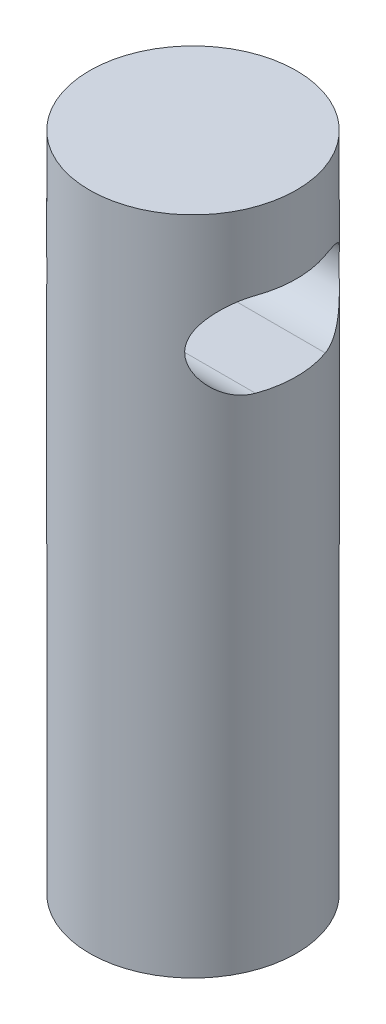
ISO-10303-21;
HEADER;
FILE_DESCRIPTION(('STEP AP214'),'2;1');
FILE_NAME('part.step','',(''),(''),'','','');
FILE_SCHEMA(('AUTOMOTIVE_DESIGN { 1 0 10303 214 1 1 1 1 }'));
ENDSEC;
DATA;
#1=APPLICATION_CONTEXT('core data for automotive mechanical design processes');
#2=APPLICATION_PROTOCOL_DEFINITION('international standard','automotive_design',2000,#1);
#3=PRODUCT_CONTEXT('',#1,'mechanical');
#4=PRODUCT('Part','Part','',(#3));
#5=PRODUCT_RELATED_PRODUCT_CATEGORY('part','',(#4));
#6=PRODUCT_DEFINITION_FORMATION('','',#4);
#7=PRODUCT_DEFINITION_CONTEXT('part definition',#1,'design');
#8=PRODUCT_DEFINITION('design','',#6,#7);
#9=PRODUCT_DEFINITION_SHAPE('','',#8);
#10=(LENGTH_UNIT() NAMED_UNIT(*) SI_UNIT(.MILLI.,.METRE.));
#11=(NAMED_UNIT(*) PLANE_ANGLE_UNIT() SI_UNIT($,.RADIAN.));
#12=(NAMED_UNIT(*) SI_UNIT($,.STERADIAN.) SOLID_ANGLE_UNIT());
#13=UNCERTAINTY_MEASURE_WITH_UNIT(LENGTH_MEASURE(1.E-05),#10,'distance_accuracy_value','');
#14=(GEOMETRIC_REPRESENTATION_CONTEXT(3) GLOBAL_UNCERTAINTY_ASSIGNED_CONTEXT((#13)) GLOBAL_UNIT_ASSIGNED_CONTEXT((#10,
#11,#12)) REPRESENTATION_CONTEXT('',''));
#15=CARTESIAN_POINT('',(0.,0.,0.));
#16=DIRECTION('',(0.,0.,1.));
#17=DIRECTION('',(1.,0.,0.));
#18=AXIS2_PLACEMENT_3D('',#15,#16,#17);
#19=CARTESIAN_POINT('',(35.4002937912872,14.9082543631315,4.51194637207664E-13));
#20=DIRECTION('',(0.,1.,0.));
#21=DIRECTION('',(0.,0.,1.));
#22=AXIS2_PLACEMENT_3D('',#19,#20,#21);
#23=PLANE('',#22);
#24=CARTESIAN_POINT('',(35.4002937912872,14.9082543631315,4.51194637207664E-13));
#25=DIRECTION('',(0.,1.,0.));
#26=DIRECTION('',(-1.,0.,0.));
#27=AXIS2_PLACEMENT_3D('',#24,#25,#26);
#28=CIRCLE('',#27,12.9417936178387);
#29=CARTESIAN_POINT('',(22.4585001734484,14.9082543631315,4.51194637207664E-13));
#30=VERTEX_POINT('',#29);
#31=EDGE_CURVE('E115',#30,#30,#28,.F.);
#32=ORIENTED_EDGE('',*,*,#31,.F.);
#33=EDGE_LOOP('',(#32));
#34=FACE_BOUND('',#33,.T.);
#35=ADVANCED_FACE('F17',(#34),#23,.T.);
#36=CARTESIAN_POINT('',(35.4002937912872,-67.7646765958145,4.51194637207664E-13));
#37=DIRECTION('',(0.,1.,0.));
#38=DIRECTION('',(0.,0.,1.));
#39=AXIS2_PLACEMENT_3D('',#36,#37,#38);
#40=PLANE('',#39);
#41=CARTESIAN_POINT('',(35.4002937912872,-67.7646765958145,4.51194637207664E-13));
#42=DIRECTION('',(0.,1.,0.));
#43=DIRECTION('',(-1.,0.,0.));
#44=AXIS2_PLACEMENT_3D('',#41,#42,#43);
#45=CIRCLE('',#44,12.9417936178387);
#46=CARTESIAN_POINT('',(22.4585001734485,-67.7646765958145,4.51194637207664E-13));
#47=VERTEX_POINT('',#46);
#48=EDGE_CURVE('E117',#47,#47,#45,.T.);
#49=ORIENTED_EDGE('',*,*,#48,.F.);
#50=EDGE_LOOP('',(#49));
#51=FACE_BOUND('',#50,.T.);
#52=ADVANCED_FACE('F135',(#51),#40,.F.);
#53=CARTESIAN_POINT('',(130.113737957699,0.,4.36306991880908));
#54=DIRECTION('',(-1.,0.,0.));
#55=DIRECTION('',(0.,0.,1.));
#56=AXIS2_PLACEMENT_3D('',#53,#54,#55);
#57=CYLINDRICAL_SURFACE('',#56,5.2931309127316);
#58=DIRECTION('',(1.,0.,0.));
#59=VECTOR('',#58,1.);
#60=CARTESIAN_POINT('',(130.113737957699,5.2931309127316,4.36306991880899));
#61=LINE('',#60,#59);
#62=CARTESIAN_POINT('',(23.216138386405,5.29313091273159,4.36306991880899));
#63=VERTEX_POINT('',#62);
#64=CARTESIAN_POINT('',(47.5844491961693,5.29313091273159,4.36306991880899));
#65=VERTEX_POINT('',#64);
#66=EDGE_CURVE('E74',#63,#65,#61,.T.);
#67=ORIENTED_EDGE('',*,*,#66,.T.);
#68=CARTESIAN_POINT('',(47.5844491961693,-5.29313091273162,4.36306991880898));
#69=CARTESIAN_POINT('',(47.5271020188366,-5.29314492778003,4.52330564350372));
#70=CARTESIAN_POINT('',(47.4665612286578,-5.28585680617279,4.68232495629311));
#71=CARTESIAN_POINT('',(47.3398025594427,-5.25743589827049,4.99666245818753));
#72=CARTESIAN_POINT('',(47.2735899938035,-5.23631594915716,5.15198394082592));
#73=CARTESIAN_POINT('',(47.1365302347509,-5.18116570919242,5.45697721985194));
#74=CARTESIAN_POINT('',(47.0657154976302,-5.14721910818373,5.60667886739294));
#75=CARTESIAN_POINT('',(46.919814134769,-5.06717971381946,5.90064707517697));
#76=CARTESIAN_POINT('',(46.8447265437414,-5.02108416726651,6.04491239495693));
#77=CARTESIAN_POINT('',(46.6147984261843,-4.86608437877842,6.46739345449884));
#78=CARTESIAN_POINT('',(46.454662589205,-4.74020535096499,6.73667877715361));
#79=CARTESIAN_POINT('',(46.1264757761287,-4.44772376924739,7.24787331192213));
#80=CARTESIAN_POINT('',(45.9584037034284,-4.28100709424203,7.48970297842774));
#81=CARTESIAN_POINT('',(45.6951557280491,-3.99078867522301,7.84419623551344));
#82=CARTESIAN_POINT('',(45.5999790530872,-3.8799042275666,7.96739130083269));
#83=CARTESIAN_POINT('',(45.4110837974091,-3.6463864564549,8.20347069289869));
#84=CARTESIAN_POINT('',(45.3173655758717,-3.52375029046515,8.31635251208857));
#85=CARTESIAN_POINT('',(45.1333502429961,-3.26706703888996,8.53097809321618));
#86=CARTESIAN_POINT('',(45.0430486364551,-3.13303575772931,8.63273684829698));
#87=CARTESIAN_POINT('',(44.8679672507369,-2.85350205798706,8.82439974968501));
#88=CARTESIAN_POINT('',(44.7831845656627,-2.70800576680439,8.9143101605129));
#89=CARTESIAN_POINT('',(44.596857808486,-2.35883120466317,9.10693257989718));
#90=CARTESIAN_POINT('',(44.4981800011797,-2.15102279582255,9.2050750944861));
#91=CARTESIAN_POINT('',(44.3224452816785,-1.71663150803967,9.37551502509914));
#92=CARTESIAN_POINT('',(44.245346993673,-1.49008565175978,9.44786197463446));
#93=CARTESIAN_POINT('',(44.1319169142332,-1.06083502395627,9.55268316136324));
#94=CARTESIAN_POINT('',(44.0909076704804,-0.860535574146742,9.58981902010655));
#95=CARTESIAN_POINT('',(44.034420433769,-0.453478951367316,9.64071539562677));
#96=CARTESIAN_POINT('',(44.0189188344552,-0.246727929888748,9.65449752574398));
#97=CARTESIAN_POINT('',(44.0154339217368,0.167566536548728,9.65760816352472));
#98=CARTESIAN_POINT('',(44.0274989285859,0.375110735358954,9.64689373225556));
#99=CARTESIAN_POINT('',(44.0776364178369,0.784425145299047,9.60181310086385));
#100=CARTESIAN_POINT('',(44.1157330161162,0.986189821489524,9.5674249690114));
#101=CARTESIAN_POINT('',(44.2257011791836,1.42774604467283,9.46620398366099));
#102=CARTESIAN_POINT('',(44.3035830127639,1.66465328273124,9.39346344609275));
#103=CARTESIAN_POINT('',(44.4831791209023,2.11841201626523,9.21990843339419));
#104=CARTESIAN_POINT('',(44.5849444130357,2.33521917315796,9.1190337726945));
#105=CARTESIAN_POINT('',(44.7698154434722,2.68376157325861,8.92826695460976));
#106=CARTESIAN_POINT('',(44.8489939556446,2.82110916884846,8.84458538236646));
#107=CARTESIAN_POINT('',(45.0124201967768,3.08568572986842,8.66669608565137));
#108=CARTESIAN_POINT('',(45.0966697803971,3.21291095322341,8.57248449907332));
#109=CARTESIAN_POINT('',(45.2684410081047,3.45731196921771,8.37418242873431));
#110=CARTESIAN_POINT('',(45.3559663909474,3.57447574310626,8.27008043466118));
#111=CARTESIAN_POINT('',(45.5326491972127,3.79850838297067,8.05264050996075));
#112=CARTESIAN_POINT('',(45.6218064466124,3.90537833915894,7.93930355975458));
#113=CARTESIAN_POINT('',(45.8024497982725,4.11091450519124,7.70116926527816));
#114=CARTESIAN_POINT('',(45.8939431781857,4.20934213858329,7.57617149311805));
#115=CARTESIAN_POINT('',(46.0760528287288,4.39488080220672,7.31732491157866));
#116=CARTESIAN_POINT('',(46.1666686918664,4.48198678823596,7.18347219680667));
#117=CARTESIAN_POINT('',(46.345622147684,4.64407622833415,6.90773179802886));
#118=CARTESIAN_POINT('',(46.4339646637474,4.71908813183959,6.76586406301956));
#119=CARTESIAN_POINT('',(46.6074792921983,4.85648960086918,6.47439258030772));
#120=CARTESIAN_POINT('',(46.6926531324546,4.91888613034735,6.32479315824746));
#121=CARTESIAN_POINT('',(46.851871543441,5.02557931183372,6.03132386768687));
#122=CARTESIAN_POINT('',(46.9262500290267,5.07095598098798,5.88802802879075));
#123=CARTESIAN_POINT('',(47.0707619352408,5.14972166059552,5.59613428667902));
#124=CARTESIAN_POINT('',(47.1408965492994,5.18311405432581,5.44753789290563));
#125=CARTESIAN_POINT('',(47.2765986708241,5.23732333290655,5.14499541840169));
#126=CARTESIAN_POINT('',(47.3421390006522,5.25807019514294,4.99102445331711));
#127=CARTESIAN_POINT('',(47.4676521579758,5.28598767891,4.67945807135853));
#128=CARTESIAN_POINT('',(47.5276195677564,5.29314521820928,4.52185930959644));
#129=CARTESIAN_POINT('',(47.5844491961693,5.29313091273158,4.36306991880898));
#130=B_SPLINE_CURVE_WITH_KNOTS('',3,(#68,#69,#70,#71,#72,#73,#74,#75,#76,#77,#78,#79,#80,#81,
#82,#83,#84,#85,#86,#87,#88,#89,#90,#91,#92,#93,#94,#95,#96,#97,#98,#99,#100,#101,#102,#103,
#104,#105,#106,#107,#108,#109,#110,#111,#112,#113,#114,#115,#116,#117,#118,#119,#120,#121,#122,
#123,#124,#125,#126,#127,#128,#129),.UNSPECIFIED.,.F.,.F.,(4,2,2,2,2,2,2,2,2,2,2,2,2,2,2,2,2,2,
2,2,2,2,2,2,2,2,2,2,2,2,4),(0.,0.510273864920578,1.02007481957415,1.52660536754971,
2.03325080446604,3.0419653804002,4.05353163552971,4.62637238859137,5.19935205322258,
5.77154959959824,6.34344338626508,7.09125363560447,7.83762008136211,8.45836038441072,
9.078525892146,9.69977929364689,10.3216090110304,11.0967021111251,11.8734662081462,
12.4106255729988,12.9479826029878,13.4859728458448,14.023906047664,14.5739381677169,
15.1242145129652,15.6731769131884,16.2218354421134,16.7244140474582,17.2268506581806,
17.7320447382484,18.2377249147446),.UNSPECIFIED.);
#131=CARTESIAN_POINT('',(47.5844491961693,-5.29313091273161,4.36306991880904));
#132=VERTEX_POINT('',#131);
#133=EDGE_CURVE('E20',#132,#65,#130,.T.);
#134=ORIENTED_EDGE('',*,*,#133,.F.);
#135=DIRECTION('',(1.,0.,0.));
#136=VECTOR('',#135,1.);
#137=CARTESIAN_POINT('',(130.113737957699,-5.2931309127316,4.36306991880899));
#138=LINE('',#137,#136);
#139=CARTESIAN_POINT('',(23.216138386405,-5.29313091273161,4.36306991880905));
#140=VERTEX_POINT('',#139);
#141=EDGE_CURVE('E69',#132,#140,#138,.F.);
#142=ORIENTED_EDGE('',*,*,#141,.T.);
#143=CARTESIAN_POINT('',(23.216138386405,5.29313091273158,4.363069918809));
#144=CARTESIAN_POINT('',(23.2734855637377,5.29314492777999,4.52330564350373));
#145=CARTESIAN_POINT('',(23.3340263539166,5.28585680617275,4.68232495629312));
#146=CARTESIAN_POINT('',(23.4607850231316,5.25743589827045,4.99666245818754));
#147=CARTESIAN_POINT('',(23.5269975887709,5.23631594915712,5.15198394082594));
#148=CARTESIAN_POINT('',(23.6640573478234,5.18116570919238,5.45697721985195));
#149=CARTESIAN_POINT('',(23.7348720849442,5.14721910818369,5.60667886739295));
#150=CARTESIAN_POINT('',(23.8807734478053,5.06717971381942,5.90064707517698));
#151=CARTESIAN_POINT('',(23.9558610388329,5.02108416726646,6.04491239495694));
#152=CARTESIAN_POINT('',(24.18578915639,4.86608437877837,6.46739345449885));
#153=CARTESIAN_POINT('',(24.3459249933694,4.74020535096495,6.73667877715362));
#154=CARTESIAN_POINT('',(24.6741118064456,4.44772376924735,7.24787331192214));
#155=CARTESIAN_POINT('',(24.842183879146,4.28100709424199,7.48970297842775));
#156=CARTESIAN_POINT('',(25.1054318545252,3.99078867522296,7.84419623551345));
#157=CARTESIAN_POINT('',(25.2006085294871,3.87990422756655,7.9673913008327));
#158=CARTESIAN_POINT('',(25.3895037851652,3.64638645645485,8.2034706928987));
#159=CARTESIAN_POINT('',(25.4832220067027,3.5237502904651,8.31635251208858));
#160=CARTESIAN_POINT('',(25.6672373395782,3.26706703888991,8.53097809321619));
#161=CARTESIAN_POINT('',(25.7575389461192,3.13303575772926,8.63273684829699));
#162=CARTESIAN_POINT('',(25.9326203318375,2.85350205798701,8.82439974968502));
#163=CARTESIAN_POINT('',(26.0174030169116,2.70800576680434,8.9143101605129));
#164=CARTESIAN_POINT('',(26.2037297740884,2.35883120466312,9.10693257989718));
#165=CARTESIAN_POINT('',(26.3024075813946,2.1510227958225,9.20507509448611));
#166=CARTESIAN_POINT('',(26.4781423008959,1.71663150803963,9.37551502509915));
#167=CARTESIAN_POINT('',(26.5552405889013,1.49008565175974,9.44786197463447));
#168=CARTESIAN_POINT('',(26.6686706683412,1.06083502395622,9.55268316136325));
#169=CARTESIAN_POINT('',(26.7096799120939,0.860535574146696,9.58981902010656));
#170=CARTESIAN_POINT('',(26.7661671488053,0.45347895136727,9.64071539562677));
#171=CARTESIAN_POINT('',(26.7816687481192,0.246727929888702,9.65449752574398));
#172=CARTESIAN_POINT('',(26.7851536608376,-0.167566536548773,9.65760816352472));
#173=CARTESIAN_POINT('',(26.7730886539884,-0.375110735358998,9.64689373225556));
#174=CARTESIAN_POINT('',(26.7229511647374,-0.784425145299091,9.60181310086385));
#175=CARTESIAN_POINT('',(26.6848545664582,-0.986189821489568,9.5674249690114));
#176=CARTESIAN_POINT('',(26.5748864033907,-1.42774604467287,9.466203983661));
#177=CARTESIAN_POINT('',(26.4970045698104,-1.66465328273128,9.39346344609276));
#178=CARTESIAN_POINT('',(26.317408461672,-2.11841201626527,9.2199084333942));
#179=CARTESIAN_POINT('',(26.2156431695386,-2.335219173158,9.1190337726945));
#180=CARTESIAN_POINT('',(26.0307721391022,-2.68376157325866,8.92826695460976));
#181=CARTESIAN_POINT('',(25.9515936269298,-2.8211091688485,8.84458538236646));
#182=CARTESIAN_POINT('',(25.7881673857975,-3.08568572986846,8.66669608565137));
#183=CARTESIAN_POINT('',(25.7039178021772,-3.21291095322345,8.57248449907332));
#184=CARTESIAN_POINT('',(25.5321465744696,-3.45731196921776,8.37418242873431));
#185=CARTESIAN_POINT('',(25.4446211916269,-3.57447574310631,8.27008043466118));
#186=CARTESIAN_POINT('',(25.2679383853616,-3.79850838297071,8.05264050996076));
#187=CARTESIAN_POINT('',(25.1787811359619,-3.90537833915898,7.93930355975459));
#188=CARTESIAN_POINT('',(24.9981377843018,-4.11091450519129,7.70116926527816));
#189=CARTESIAN_POINT('',(24.9066444043886,-4.20934213858334,7.57617149311805));
#190=CARTESIAN_POINT('',(24.7245347538456,-4.39488080220676,7.31732491157866));
#191=CARTESIAN_POINT('',(24.6339188907079,-4.48198678823601,7.18347219680667));
#192=CARTESIAN_POINT('',(24.4549654348904,-4.64407622833419,6.90773179802886));
#193=CARTESIAN_POINT('',(24.3666229188269,-4.71908813183963,6.76586406301956));
#194=CARTESIAN_POINT('',(24.193108290376,-4.85648960086923,6.47439258030772));
#195=CARTESIAN_POINT('',(24.1079344501197,-4.9188861303474,6.32479315824746));
#196=CARTESIAN_POINT('',(23.9487160391333,-5.02557931183376,6.03132386768687));
#197=CARTESIAN_POINT('',(23.8743375535477,-5.07095598098802,5.88802802879076));
#198=CARTESIAN_POINT('',(23.7298256473336,-5.14972166059556,5.59613428667902));
#199=CARTESIAN_POINT('',(23.659691033275,-5.18311405432586,5.44753789290563));
#200=CARTESIAN_POINT('',(23.5239889117502,-5.23732333290659,5.14499541840169));
#201=CARTESIAN_POINT('',(23.4584485819222,-5.25807019514298,4.99102445331712));
#202=CARTESIAN_POINT('',(23.3329354245985,-5.28598767891004,4.67945807135854));
#203=CARTESIAN_POINT('',(23.2729680148179,-5.29314521820932,4.52185930959645));
#204=CARTESIAN_POINT('',(23.216138386405,-5.29313091273163,4.36306991880899));
#205=B_SPLINE_CURVE_WITH_KNOTS('',3,(#143,#144,#145,#146,#147,#148,#149,#150,#151,#152,#153,
#154,#155,#156,#157,#158,#159,#160,#161,#162,#163,#164,#165,#166,#167,#168,#169,#170,#171,#172,
#173,#174,#175,#176,#177,#178,#179,#180,#181,#182,#183,#184,#185,#186,#187,#188,#189,#190,#191,
#192,#193,#194,#195,#196,#197,#198,#199,#200,#201,#202,#203,#204),.UNSPECIFIED.,.F.,.F.,(4,2,2,
2,2,2,2,2,2,2,2,2,2,2,2,2,2,2,2,2,2,2,2,2,2,2,2,2,2,2,4),(0.,0.510273864920579,1.02007481957415,
1.52660536754971,2.03325080446604,3.04196538040021,4.05353163552971,4.62637238859137,
5.19935205322258,5.77154959959824,6.34344338626508,7.09125363560447,7.83762008136211,
8.45836038441072,9.078525892146,9.69977929364688,10.3216090110304,11.0967021111251,
11.8734662081462,12.4106255729988,12.9479826029878,13.4859728458448,14.023906047664,
14.5739381677169,15.1242145129652,15.6731769131884,16.2218354421134,16.7244140474582,
17.2268506581806,17.7320447382484,18.2377249147446),.UNSPECIFIED.);
#206=EDGE_CURVE('E103',#63,#140,#205,.T.);
#207=ORIENTED_EDGE('',*,*,#206,.F.);
#208=EDGE_LOOP('',(#67,#134,#142,#207));
#209=FACE_BOUND('',#208,.T.);
#210=ADVANCED_FACE('F71',(#209),#57,.F.);
#211=CARTESIAN_POINT('',(130.113737957699,-5.2931309127316,4.36306991880897));
#212=DIRECTION('',(0.,-1.,0.));
#213=DIRECTION('',(0.,0.,-1.));
#214=AXIS2_PLACEMENT_3D('',#211,#212,#213);
#215=PLANE('',#214);
#216=ORIENTED_EDGE('',*,*,#141,.F.);
#217=CARTESIAN_POINT('',(35.4002937912872,-5.2931309127316,4.51194637207664E-13));
#218=DIRECTION('',(0.,1.,0.));
#219=DIRECTION('',(-1.,0.,0.));
#220=AXIS2_PLACEMENT_3D('',#217,#218,#219);
#221=CIRCLE('',#220,12.9417936178387);
#222=CARTESIAN_POINT('',(47.584449196169,-5.29313091273161,-4.36306991880902));
#223=VERTEX_POINT('',#222);
#224=EDGE_CURVE('E61',#223,#132,#221,.F.);
#225=ORIENTED_EDGE('',*,*,#224,.F.);
#226=DIRECTION('',(-1.,0.,0.));
#227=VECTOR('',#226,1.);
#228=CARTESIAN_POINT('',(130.113737957699,-5.2931309127316,-4.36306991880903));
#229=LINE('',#228,#227);
#230=CARTESIAN_POINT('',(23.2161383864053,-5.29313091273161,-4.36306991880902));
#231=VERTEX_POINT('',#230);
#232=EDGE_CURVE('E81',#223,#231,#229,.T.);
#233=ORIENTED_EDGE('',*,*,#232,.T.);
#234=CARTESIAN_POINT('',(35.4002937912872,-5.2931309127316,4.51194637207664E-13));
#235=DIRECTION('',(0.,1.,0.));
#236=DIRECTION('',(-1.,0.,0.));
#237=AXIS2_PLACEMENT_3D('',#234,#235,#236);
#238=CIRCLE('',#237,12.9417936178387);
#239=EDGE_CURVE('E78',#140,#231,#238,.F.);
#240=ORIENTED_EDGE('',*,*,#239,.F.);
#241=EDGE_LOOP('',(#216,#225,#233,#240));
#242=FACE_BOUND('',#241,.T.);
#243=ADVANCED_FACE('F76',(#242),#215,.F.);
#244=CARTESIAN_POINT('',(130.113737957699,0.,-4.36306991880904));
#245=DIRECTION('',(-1.,0.,0.));
#246=DIRECTION('',(0.,0.,1.));
#247=AXIS2_PLACEMENT_3D('',#244,#245,#246);
#248=CYLINDRICAL_SURFACE('',#247,5.2931309127316);
#249=ORIENTED_EDGE('',*,*,#232,.F.);
#250=CARTESIAN_POINT('',(47.584449196169,5.29313091273158,-4.36306991880911));
#251=CARTESIAN_POINT('',(47.5271020188362,5.29314492777999,-4.52330564350385));
#252=CARTESIAN_POINT('',(47.4665612286573,5.28585680617274,-4.68232495629325));
#253=CARTESIAN_POINT('',(47.3398025594423,5.25743589827043,-4.99666245818768));
#254=CARTESIAN_POINT('',(47.273589993803,5.23631594915709,-5.15198394082608));
#255=CARTESIAN_POINT('',(47.1365302347504,5.18116570919234,-5.4569772198521));
#256=CARTESIAN_POINT('',(47.0657154976297,5.14721910818364,-5.60667886739311));
#257=CARTESIAN_POINT('',(46.9198141347684,5.06717971381935,-5.90064707517714));
#258=CARTESIAN_POINT('',(46.8447265437408,5.02108416726639,-6.0449123949571));
#259=CARTESIAN_POINT('',(46.6147984261837,4.86608437877827,-6.46739345449901));
#260=CARTESIAN_POINT('',(46.4546625892043,4.74020535096483,-6.73667877715379));
#261=CARTESIAN_POINT('',(46.126475776128,4.44772376924719,-7.24787331192231));
#262=CARTESIAN_POINT('',(45.9584037034276,4.28100709424181,-7.48970297842791));
#263=CARTESIAN_POINT('',(45.6951557280483,3.99078867522275,-7.84419623551361));
#264=CARTESIAN_POINT('',(45.5999790530864,3.87990422756633,-7.96739130083285));
#265=CARTESIAN_POINT('',(45.4110837974082,3.6463864564546,-8.20347069289885));
#266=CARTESIAN_POINT('',(45.3173655758708,3.52375029046484,-8.31635251208873));
#267=CARTESIAN_POINT('',(45.1333502429952,3.26706703888962,-8.53097809321634));
#268=CARTESIAN_POINT('',(45.0430486364542,3.13303575772895,-8.63273684829714));
#269=CARTESIAN_POINT('',(44.8679672507359,2.85350205798667,-8.82439974968515));
#270=CARTESIAN_POINT('',(44.7831845656617,2.70800576680398,-8.91431016051303));
#271=CARTESIAN_POINT('',(44.596857808485,2.35883120466276,-9.10693257989728));
#272=CARTESIAN_POINT('',(44.4981800011787,2.15102279582216,-9.20507509448617));
#273=CARTESIAN_POINT('',(44.3224452816775,1.71663150803933,-9.37551502509916));
#274=CARTESIAN_POINT('',(44.2453469936721,1.49008565175947,-9.44786197463445));
#275=CARTESIAN_POINT('',(44.1319169142322,1.06083502395601,-9.55268316136321));
#276=CARTESIAN_POINT('',(44.0909076704795,0.8605355741465,-9.5898190201065));
#277=CARTESIAN_POINT('',(44.0344204337681,0.453478951367117,-9.6407153956267));
#278=CARTESIAN_POINT('',(44.0189188344542,0.246727929888571,-9.6544975257439));
#279=CARTESIAN_POINT('',(44.0154339217359,-0.167566536548859,-9.65760816352463));
#280=CARTESIAN_POINT('',(44.027498928585,-0.375110735359061,-9.64689373225547));
#281=CARTESIAN_POINT('',(44.077636417836,-0.784425145299107,-9.60181310086376));
#282=CARTESIAN_POINT('',(44.1157330161153,-0.98618982148956,-9.56742496901131));
#283=CARTESIAN_POINT('',(44.2257011791828,-1.42774604467283,-9.46620398366092));
#284=CARTESIAN_POINT('',(44.303583012763,-1.66465328273122,-9.39346344609269));
#285=CARTESIAN_POINT('',(44.4831791209015,-2.1184120162652,-9.21990843339414));
#286=CARTESIAN_POINT('',(44.5849444130349,-2.3352191731579,-9.11903377269446));
#287=CARTESIAN_POINT('',(44.7698154434713,-2.68376157325855,-8.92826695460973));
#288=CARTESIAN_POINT('',(44.8489939556437,-2.8211091688484,-8.84458538236643));
#289=CARTESIAN_POINT('',(45.012420196776,-3.08568572986837,-8.66669608565135));
#290=CARTESIAN_POINT('',(45.0966697803963,-3.21291095322336,-8.5724844990733));
#291=CARTESIAN_POINT('',(45.268441008104,-3.45731196921767,-8.37418242873429));
#292=CARTESIAN_POINT('',(45.3559663909467,-3.57447574310622,-8.27008043466116));
#293=CARTESIAN_POINT('',(45.532649197212,-3.79850838297063,-8.05264050996075));
#294=CARTESIAN_POINT('',(45.6218064466117,-3.9053783391589,-7.93930355975458));
#295=CARTESIAN_POINT('',(45.8024497982719,-4.11091450519122,-7.70116926527816));
#296=CARTESIAN_POINT('',(45.8939431781851,-4.20934213858327,-7.57617149311805));
#297=CARTESIAN_POINT('',(46.0760528287282,-4.3948808022067,-7.31732491157865));
#298=CARTESIAN_POINT('',(46.1666686918658,-4.48198678823595,-7.18347219680666));
#299=CARTESIAN_POINT('',(46.3456221476834,-4.64407622833414,-6.90773179802886));
#300=CARTESIAN_POINT('',(46.4339646637469,-4.71908813183959,-6.76586406301956));
#301=CARTESIAN_POINT('',(46.6074792921978,-4.85648960086919,-6.47439258030772));
#302=CARTESIAN_POINT('',(46.6926531324541,-4.91888613034736,-6.32479315824745));
#303=CARTESIAN_POINT('',(46.8518715434405,-5.02557931183373,-6.03132386768686));
#304=CARTESIAN_POINT('',(46.9262500290262,-5.07095598098799,-5.88802802879075));
#305=CARTESIAN_POINT('',(47.0707619352403,-5.14972166059553,-5.59613428667902));
#306=CARTESIAN_POINT('',(47.140896549299,-5.18311405432583,-5.44753789290564));
#307=CARTESIAN_POINT('',(47.2765986708237,-5.23732333290657,-5.14499541840171));
#308=CARTESIAN_POINT('',(47.3421390006518,-5.25807019514296,-4.99102445331713));
#309=CARTESIAN_POINT('',(47.4676521579755,-5.28598767891003,-4.67945807135856));
#310=CARTESIAN_POINT('',(47.5276195677561,-5.29314521820931,-4.52185930959647));
#311=CARTESIAN_POINT('',(47.584449196169,-5.29313091273162,-4.36306991880902));
#312=B_SPLINE_CURVE_WITH_KNOTS('',3,(#250,#251,#252,#253,#254,#255,#256,#257,#258,#259,#260,
#261,#262,#263,#264,#265,#266,#267,#268,#269,#270,#271,#272,#273,#274,#275,#276,#277,#278,#279,
#280,#281,#282,#283,#284,#285,#286,#287,#288,#289,#290,#291,#292,#293,#294,#295,#296,#297,#298,
#299,#300,#301,#302,#303,#304,#305,#306,#307,#308,#309,#310,#311),.UNSPECIFIED.,.F.,.F.,(4,2,2,
2,2,2,2,2,2,2,2,2,2,2,2,2,2,2,2,2,2,2,2,2,2,2,2,2,2,2,4),(0.,0.510273864920616,1.02007481957423,
1.52660536754982,2.03325080446618,3.04196538040042,4.05353163553,4.62637238859171,
5.19935205322297,5.77154959959868,6.34344338626558,7.09125363560487,7.83762008136241,
8.45836038441095,9.07852589214616,9.69977929364698,10.3216090110304,11.0967021111251,
11.8734662081462,12.4106255729988,12.9479826029878,13.4859728458449,14.023906047664,
14.5739381677169,15.1242145129653,15.6731769131885,16.2218354421136,16.7244140474584,
17.2268506581808,17.7320447382486,18.2377249147448),.UNSPECIFIED.);
#313=CARTESIAN_POINT('',(47.584449196169,5.29313091273161,-4.36306991880907));
#314=VERTEX_POINT('',#313);
#315=EDGE_CURVE('E65',#314,#223,#312,.T.);
#316=ORIENTED_EDGE('',*,*,#315,.F.);
#317=DIRECTION('',(1.,0.,0.));
#318=VECTOR('',#317,1.);
#319=CARTESIAN_POINT('',(130.113737957699,5.2931309127316,-4.36306991880913));
#320=LINE('',#319,#318);
#321=CARTESIAN_POINT('',(23.2161383864054,5.2931309127316,-4.36306991880907));
#322=VERTEX_POINT('',#321);
#323=EDGE_CURVE('E40',#314,#322,#320,.F.);
#324=ORIENTED_EDGE('',*,*,#323,.T.);
#325=CARTESIAN_POINT('',(23.2161383864053,-5.29313091273163,-4.36306991880903));
#326=CARTESIAN_POINT('',(23.2734855637381,-5.29314492778003,-4.52330564350377));
#327=CARTESIAN_POINT('',(23.334026353917,-5.28585680617279,-4.68232495629316));
#328=CARTESIAN_POINT('',(23.460785023132,-5.25743589827048,-4.99666245818759));
#329=CARTESIAN_POINT('',(23.5269975887713,-5.23631594915714,-5.15198394082599));
#330=CARTESIAN_POINT('',(23.6640573478239,-5.1811657091924,-5.45697721985201));
#331=CARTESIAN_POINT('',(23.7348720849446,-5.1472191081837,-5.60667886739302));
#332=CARTESIAN_POINT('',(23.8807734478058,-5.06717971381942,-5.90064707517705));
#333=CARTESIAN_POINT('',(23.9558610388334,-5.02108416726646,-6.04491239495702));
#334=CARTESIAN_POINT('',(24.1857891563906,-4.86608437877835,-6.46739345449893));
#335=CARTESIAN_POINT('',(24.34592499337,-4.74020535096491,-6.7366787771537));
#336=CARTESIAN_POINT('',(24.6741118064463,-4.44772376924728,-7.24787331192222));
#337=CARTESIAN_POINT('',(24.8421838791467,-4.28100709424191,-7.48970297842783));
#338=CARTESIAN_POINT('',(25.105431854526,-3.99078867522286,-7.84419623551353));
#339=CARTESIAN_POINT('',(25.2006085294879,-3.87990422756644,-7.96739130083278));
#340=CARTESIAN_POINT('',(25.389503785166,-3.64638645645471,-8.20347069289878));
#341=CARTESIAN_POINT('',(25.4832220067035,-3.52375029046495,-8.31635251208866));
#342=CARTESIAN_POINT('',(25.6672373395791,-3.26706703888974,-8.53097809321627));
#343=CARTESIAN_POINT('',(25.7575389461201,-3.13303575772907,-8.63273684829707));
#344=CARTESIAN_POINT('',(25.9326203318384,-2.8535020579868,-8.82439974968509));
#345=CARTESIAN_POINT('',(26.0174030169125,-2.70800576680411,-8.91431016051298));
#346=CARTESIAN_POINT('',(26.2037297740893,-2.3588312046629,-9.10693257989723));
#347=CARTESIAN_POINT('',(26.3024075813956,-2.1510227958223,-9.20507509448612));
#348=CARTESIAN_POINT('',(26.4781423008968,-1.71663150803946,-9.37551502509912));
#349=CARTESIAN_POINT('',(26.5552405889022,-1.4900856517596,-9.44786197463443));
#350=CARTESIAN_POINT('',(26.6686706683421,-1.06083502395613,-9.55268316136319));
#351=CARTESIAN_POINT('',(26.7096799120948,-0.860535574146625,-9.58981902010649));
#352=CARTESIAN_POINT('',(26.7661671488062,-0.45347895136724,-9.64071539562669));
#353=CARTESIAN_POINT('',(26.7816687481201,-0.246727929888693,-9.65449752574389));
#354=CARTESIAN_POINT('',(26.7851536608385,0.167566536548741,-9.65760816352463));
#355=CARTESIAN_POINT('',(26.7730886539893,0.375110735358946,-9.64689373225547));
#356=CARTESIAN_POINT('',(26.7229511647384,0.784425145298997,-9.60181310086377));
#357=CARTESIAN_POINT('',(26.6848545664591,0.986189821489452,-9.56742496901132));
#358=CARTESIAN_POINT('',(26.5748864033916,1.42774604467272,-9.46620398366094));
#359=CARTESIAN_POINT('',(26.4970045698113,1.66465328273111,-9.39346344609271));
#360=CARTESIAN_POINT('',(26.3174084616729,2.11841201626508,-9.21990843339417));
#361=CARTESIAN_POINT('',(26.2156431695395,2.33521917315779,-9.11903377269449));
#362=CARTESIAN_POINT('',(26.030772139103,2.68376157325844,-8.92826695460976));
#363=CARTESIAN_POINT('',(25.9515936269306,2.82110916884829,-8.84458538236647));
#364=CARTESIAN_POINT('',(25.7881673857983,3.08568572986826,-8.66669608565139));
#365=CARTESIAN_POINT('',(25.7039178021781,3.21291095322325,-8.57248449907335));
#366=CARTESIAN_POINT('',(25.5321465744704,3.45731196921756,-8.37418242873435));
#367=CARTESIAN_POINT('',(25.4446211916277,3.57447574310611,-8.27008043466122));
#368=CARTESIAN_POINT('',(25.2679383853624,3.79850838297052,-8.05264050996081));
#369=CARTESIAN_POINT('',(25.1787811359627,3.9053783391588,-7.93930355975465));
#370=CARTESIAN_POINT('',(24.9981377843025,4.11091450519111,-7.70116926527823));
#371=CARTESIAN_POINT('',(24.9066444043893,4.20934213858316,-7.57617149311812));
#372=CARTESIAN_POINT('',(24.7245347538462,4.3948808022066,-7.31732491157874));
#373=CARTESIAN_POINT('',(24.6339188907086,4.48198678823585,-7.18347219680675));
#374=CARTESIAN_POINT('',(24.454965434891,4.64407622833405,-6.90773179802895));
#375=CARTESIAN_POINT('',(24.3666229188275,4.71908813183949,-6.76586406301965));
#376=CARTESIAN_POINT('',(24.1931082903766,4.8564896008691,-6.47439258030782));
#377=CARTESIAN_POINT('',(24.1079344501203,4.91888613034728,-6.32479315824756));
#378=CARTESIAN_POINT('',(23.9487160391339,5.02557931183365,-6.03132386768697));
#379=CARTESIAN_POINT('',(23.8743375535482,5.07095598098792,-5.88802802879086));
#380=CARTESIAN_POINT('',(23.729825647334,5.14972166059546,-5.59613428667914));
#381=CARTESIAN_POINT('',(23.6596910332754,5.18311405432577,-5.44753789290575));
#382=CARTESIAN_POINT('',(23.5239889117506,5.23732333290651,-5.14499541840182));
#383=CARTESIAN_POINT('',(23.4584485819226,5.2580701951429,-4.99102445331725));
#384=CARTESIAN_POINT('',(23.3329354245989,5.28598767890998,-4.67945807135867));
#385=CARTESIAN_POINT('',(23.2729680148183,5.29314521820927,-4.52185930959658));
#386=CARTESIAN_POINT('',(23.2161383864054,5.29313091273158,-4.36306991880913));
#387=B_SPLINE_CURVE_WITH_KNOTS('',3,(#325,#326,#327,#328,#329,#330,#331,#332,#333,#334,#335,
#336,#337,#338,#339,#340,#341,#342,#343,#344,#345,#346,#347,#348,#349,#350,#351,#352,#353,#354,
#355,#356,#357,#358,#359,#360,#361,#362,#363,#364,#365,#366,#367,#368,#369,#370,#371,#372,#373,
#374,#375,#376,#377,#378,#379,#380,#381,#382,#383,#384,#385,#386),.UNSPECIFIED.,.F.,.F.,(4,2,2,
2,2,2,2,2,2,2,2,2,2,2,2,2,2,2,2,2,2,2,2,2,2,2,2,2,2,2,4),(0.,0.510273864920613,1.02007481957422,
1.52660536754981,2.03325080446617,3.0419653804004,4.05353163552997,4.62637238859168,
5.19935205322294,5.77154959959865,6.34344338626554,7.09125363560484,7.8376200813624,
8.45836038441095,9.07852589214617,9.69977929364699,10.3216090110304,11.0967021111251,
11.8734662081462,12.4106255729988,12.9479826029878,13.4859728458448,14.023906047664,
14.5739381677169,15.1242145129653,15.6731769131885,16.2218354421135,16.7244140474583,
17.2268506581807,17.7320447382485,18.2377249147447),.UNSPECIFIED.);
#388=EDGE_CURVE('E31',#231,#322,#387,.T.);
#389=ORIENTED_EDGE('',*,*,#388,.F.);
#390=EDGE_LOOP('',(#249,#316,#324,#389));
#391=FACE_BOUND('',#390,.T.);
#392=ADVANCED_FACE('F93',(#391),#248,.F.);
#393=CARTESIAN_POINT('',(130.113737957699,5.2931309127316,-4.36306991880915));
#394=DIRECTION('',(0.,1.,0.));
#395=DIRECTION('',(0.,0.,1.));
#396=AXIS2_PLACEMENT_3D('',#393,#394,#395);
#397=PLANE('',#396);
#398=ORIENTED_EDGE('',*,*,#323,.F.);
#399=CARTESIAN_POINT('',(35.4002937912872,5.29313091273161,4.51194637207664E-13));
#400=DIRECTION('',(0.,1.,0.));
#401=DIRECTION('',(-1.,0.,0.));
#402=AXIS2_PLACEMENT_3D('',#399,#400,#401);
#403=CIRCLE('',#402,12.9417936178387);
#404=EDGE_CURVE('E113',#65,#314,#403,.T.);
#405=ORIENTED_EDGE('',*,*,#404,.F.);
#406=ORIENTED_EDGE('',*,*,#66,.F.);
#407=CARTESIAN_POINT('',(35.4002937912872,5.29313091273161,4.51194637207664E-13));
#408=DIRECTION('',(0.,1.,0.));
#409=DIRECTION('',(-1.,0.,0.));
#410=AXIS2_PLACEMENT_3D('',#407,#408,#409);
#411=CIRCLE('',#410,12.9417936178387);
#412=EDGE_CURVE('E11',#322,#63,#411,.T.);
#413=ORIENTED_EDGE('',*,*,#412,.F.);
#414=EDGE_LOOP('',(#398,#405,#406,#413));
#415=FACE_BOUND('',#414,.T.);
#416=ADVANCED_FACE('F99',(#415),#397,.F.);
#417=CARTESIAN_POINT('',(35.4002937912872,-67.7646765958145,4.51194637207664E-13));
#418=DIRECTION('',(0.,1.,0.));
#419=DIRECTION('',(-1.,0.,0.));
#420=AXIS2_PLACEMENT_3D('',#417,#418,#419);
#421=CYLINDRICAL_SURFACE('',#420,12.9417936178387);
#422=ORIENTED_EDGE('',*,*,#31,.T.);
#423=EDGE_LOOP('',(#422));
#424=FACE_BOUND('',#423,.T.);
#425=ORIENTED_EDGE('',*,*,#388,.T.);
#426=ORIENTED_EDGE('',*,*,#412,.T.);
#427=ORIENTED_EDGE('',*,*,#206,.T.);
#428=ORIENTED_EDGE('',*,*,#239,.T.);
#429=EDGE_LOOP('',(#425,#426,#427,#428));
#430=FACE_BOUND('',#429,.T.);
#431=ORIENTED_EDGE('',*,*,#48,.T.);
#432=EDGE_LOOP('',(#431));
#433=FACE_BOUND('',#432,.T.);
#434=ORIENTED_EDGE('',*,*,#315,.T.);
#435=ORIENTED_EDGE('',*,*,#224,.T.);
#436=ORIENTED_EDGE('',*,*,#133,.T.);
#437=ORIENTED_EDGE('',*,*,#404,.T.);
#438=EDGE_LOOP('',(#434,#435,#436,#437));
#439=FACE_BOUND('',#438,.T.);
#440=ADVANCED_FACE('F63',(#424,#430,#433,#439),#421,.T.);
#441=CLOSED_SHELL('',(#35,#52,#210,#243,#392,#416,#440));
#442=MANIFOLD_SOLID_BREP('B1',#441);
#443=ADVANCED_BREP_SHAPE_REPRESENTATION('',(#18,#442),#14);
#444=SHAPE_DEFINITION_REPRESENTATION(#9,#443);
ENDSEC;
END-ISO-10303-21;
